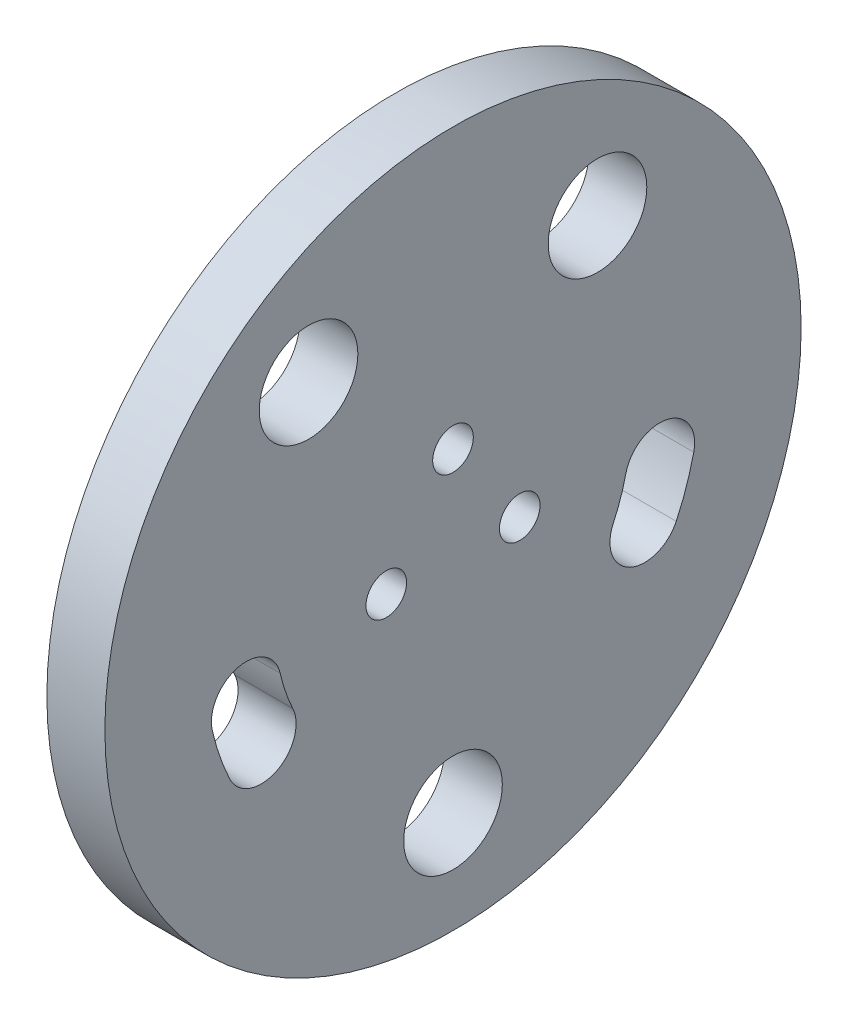
ISO-10303-21;
HEADER;
FILE_DESCRIPTION(('STEP AP214'),'2;1');
FILE_NAME('part.step','',(''),(''),'','','');
FILE_SCHEMA(('AUTOMOTIVE_DESIGN { 1 0 10303 214 1 1 1 1 }'));
ENDSEC;
DATA;
#1=APPLICATION_CONTEXT('core data for automotive mechanical design processes');
#2=APPLICATION_PROTOCOL_DEFINITION('international standard','automotive_design',2000,#1);
#3=PRODUCT_CONTEXT('',#1,'mechanical');
#4=PRODUCT('Part','Part','',(#3));
#5=PRODUCT_RELATED_PRODUCT_CATEGORY('part','',(#4));
#6=PRODUCT_DEFINITION_FORMATION('','',#4);
#7=PRODUCT_DEFINITION_CONTEXT('part definition',#1,'design');
#8=PRODUCT_DEFINITION('design','',#6,#7);
#9=PRODUCT_DEFINITION_SHAPE('','',#8);
#10=(LENGTH_UNIT() NAMED_UNIT(*) SI_UNIT(.MILLI.,.METRE.));
#11=(NAMED_UNIT(*) PLANE_ANGLE_UNIT() SI_UNIT($,.RADIAN.));
#12=(NAMED_UNIT(*) SI_UNIT($,.STERADIAN.) SOLID_ANGLE_UNIT());
#13=UNCERTAINTY_MEASURE_WITH_UNIT(LENGTH_MEASURE(1.E-05),#10,'distance_accuracy_value','');
#14=(GEOMETRIC_REPRESENTATION_CONTEXT(3) GLOBAL_UNCERTAINTY_ASSIGNED_CONTEXT((#13)) GLOBAL_UNIT_ASSIGNED_CONTEXT((#10,
#11,#12)) REPRESENTATION_CONTEXT('',''));
#15=CARTESIAN_POINT('',(0.,0.,0.));
#16=DIRECTION('',(0.,0.,1.));
#17=DIRECTION('',(1.,0.,0.));
#18=AXIS2_PLACEMENT_3D('',#15,#16,#17);
#19=CARTESIAN_POINT('',(0.,0.,0.));
#20=DIRECTION('',(1.,0.,0.));
#21=DIRECTION('',(0.,0.,-1.));
#22=AXIS2_PLACEMENT_3D('',#19,#20,#21);
#23=PLANE('',#22);
#24=DIRECTION('',(0.,0.,-1.));
#25=VECTOR('',#24,1.);
#26=CARTESIAN_POINT('',(0.,-7.44980159550946,-4.25678106682922));
#27=LINE('',#26,#25);
#28=CARTESIAN_POINT('',(0.,-7.44980159550946,4.25678106682922));
#29=VERTEX_POINT('',#28);
#30=CARTESIAN_POINT('',(0.,-7.44980159550946,-4.25678106682922));
#31=VERTEX_POINT('',#30);
#32=EDGE_CURVE('E161',#29,#31,#27,.T.);
#33=ORIENTED_EDGE('',*,*,#32,.F.);
#34=DIRECTION('',(0.,1.,0.));
#35=VECTOR('',#34,1.);
#36=CARTESIAN_POINT('',(0.,-7.44980159550946,4.25678106682922));
#37=LINE('',#36,#35);
#38=CARTESIAN_POINT('',(0.,-7.54980159550946,4.25678106682922));
#39=VERTEX_POINT('',#38);
#40=EDGE_CURVE('E58',#39,#29,#37,.T.);
#41=ORIENTED_EDGE('',*,*,#40,.F.);
#42=DIRECTION('',(0.,0.,1.));
#43=VECTOR('',#42,1.);
#44=CARTESIAN_POINT('',(0.,-7.54980159550946,-4.25678106682922));
#45=LINE('',#44,#43);
#46=CARTESIAN_POINT('',(0.,-7.54980159550946,-4.25678106682922));
#47=VERTEX_POINT('',#46);
#48=EDGE_CURVE('E152',#47,#39,#45,.T.);
#49=ORIENTED_EDGE('',*,*,#48,.F.);
#50=DIRECTION('',(0.,-1.,0.));
#51=VECTOR('',#50,1.);
#52=CARTESIAN_POINT('',(0.,-7.44980159550946,-4.25678106682922));
#53=LINE('',#52,#51);
#54=EDGE_CURVE('E155',#31,#47,#53,.T.);
#55=ORIENTED_EDGE('',*,*,#54,.F.);
#56=EDGE_LOOP('',(#33,#41,#49,#55));
#57=FACE_BOUND('',#56,.T.);
#58=CARTESIAN_POINT('',(0.,0.,0.));
#59=DIRECTION('',(1.,0.,0.));
#60=DIRECTION('',(0.,0.,-1.));
#61=AXIS2_PLACEMENT_3D('',#58,#59,#60);
#62=CIRCLE('',#61,15.2636934928289);
#63=CARTESIAN_POINT('',(0.,-3.34295875011745,14.8931180697005));
#64=VERTEX_POINT('',#63);
#65=CARTESIAN_POINT('',(0.,-6.50496417202533,13.8081780175262));
#66=VERTEX_POINT('',#65);
#67=EDGE_CURVE('E193',#64,#66,#62,.T.);
#68=ORIENTED_EDGE('',*,*,#67,.F.);
#69=CARTESIAN_POINT('',(0.,-4.,17.8202833871967));
#70=DIRECTION('',(1.,0.,0.));
#71=DIRECTION('',(0.,0.,-1.));
#72=AXIS2_PLACEMENT_3D('',#69,#70,#71);
#73=CIRCLE('',#72,3.);
#74=CARTESIAN_POINT('',(0.,-4.65704124988254,20.747448704693));
#75=VERTEX_POINT('',#74);
#76=EDGE_CURVE('E183',#64,#75,#73,.T.);
#77=ORIENTED_EDGE('',*,*,#76,.T.);
#78=CARTESIAN_POINT('',(0.,0.,0.));
#79=DIRECTION('',(1.,0.,0.));
#80=DIRECTION('',(0.,0.,-1.));
#81=AXIS2_PLACEMENT_3D('',#78,#79,#80);
#82=CIRCLE('',#81,21.2636934928289);
#83=CARTESIAN_POINT('',(0.,-9.06199829030665,19.2360299423621));
#84=VERTEX_POINT('',#83);
#85=EDGE_CURVE('E186',#75,#84,#82,.T.);
#86=ORIENTED_EDGE('',*,*,#85,.T.);
#87=CARTESIAN_POINT('',(0.,-7.78348123116599,16.5221039799442));
#88=DIRECTION('',(1.,0.,0.));
#89=DIRECTION('',(0.,0.,-1.));
#90=AXIS2_PLACEMENT_3D('',#87,#88,#89);
#91=CIRCLE('',#90,3.);
#92=EDGE_CURVE('E190',#84,#66,#91,.T.);
#93=ORIENTED_EDGE('',*,*,#92,.T.);
#94=EDGE_LOOP('',(#68,#77,#86,#93));
#95=FACE_BOUND('',#94,.T.);
#96=CARTESIAN_POINT('',(0.,0.,0.));
#97=DIRECTION('',(1.,0.,0.));
#98=DIRECTION('',(0.,0.,-1.));
#99=AXIS2_PLACEMENT_3D('',#96,#97,#98);
#100=CIRCLE('',#99,15.2636934928289);
#101=CARTESIAN_POINT('',(0.,-6.50496417202534,-13.8081780175262));
#102=VERTEX_POINT('',#101);
#103=CARTESIAN_POINT('',(0.,-3.34295875011745,-14.8931180697005));
#104=VERTEX_POINT('',#103);
#105=EDGE_CURVE('E217',#102,#104,#100,.T.);
#106=ORIENTED_EDGE('',*,*,#105,.F.);
#107=CARTESIAN_POINT('',(0.,-7.78348123116599,-16.5221039799442));
#108=DIRECTION('',(1.,0.,0.));
#109=DIRECTION('',(0.,0.,-1.));
#110=AXIS2_PLACEMENT_3D('',#107,#108,#109);
#111=CIRCLE('',#110,3.);
#112=CARTESIAN_POINT('',(0.,-9.06199829030666,-19.2360299423621));
#113=VERTEX_POINT('',#112);
#114=EDGE_CURVE('E227',#102,#113,#111,.T.);
#115=ORIENTED_EDGE('',*,*,#114,.T.);
#116=CARTESIAN_POINT('',(0.,0.,0.));
#117=DIRECTION('',(1.,0.,0.));
#118=DIRECTION('',(0.,0.,-1.));
#119=AXIS2_PLACEMENT_3D('',#116,#117,#118);
#120=CIRCLE('',#119,21.2636934928289);
#121=CARTESIAN_POINT('',(0.,-4.65704124988254,-20.747448704693));
#122=VERTEX_POINT('',#121);
#123=EDGE_CURVE('E238',#113,#122,#120,.T.);
#124=ORIENTED_EDGE('',*,*,#123,.T.);
#125=CARTESIAN_POINT('',(0.,-4.,-17.8202833871967));
#126=DIRECTION('',(1.,0.,0.));
#127=DIRECTION('',(0.,0.,-1.));
#128=AXIS2_PLACEMENT_3D('',#125,#126,#127);
#129=CIRCLE('',#128,3.);
#130=EDGE_CURVE('E235',#122,#104,#129,.T.);
#131=ORIENTED_EDGE('',*,*,#130,.T.);
#132=EDGE_LOOP('',(#106,#115,#124,#131));
#133=FACE_BOUND('',#132,.T.);
#134=CARTESIAN_POINT('',(0.,5.9534,0.));
#135=DIRECTION('',(1.,0.,0.));
#136=DIRECTION('',(0.,0.,-1.));
#137=AXIS2_PLACEMENT_3D('',#134,#135,#136);
#138=CIRCLE('',#137,1.74999999999999);
#139=CARTESIAN_POINT('',(0.,5.9534,-1.74999999999999));
#140=VERTEX_POINT('',#139);
#141=EDGE_CURVE('E45',#140,#140,#138,.T.);
#142=ORIENTED_EDGE('',*,*,#141,.T.);
#143=EDGE_LOOP('',(#142));
#144=FACE_BOUND('',#143,.T.);
#145=CARTESIAN_POINT('',(0.,-2.,5.75000000000001));
#146=DIRECTION('',(1.,0.,0.));
#147=DIRECTION('',(0.,0.,-1.));
#148=AXIS2_PLACEMENT_3D('',#145,#146,#147);
#149=CIRCLE('',#148,1.74999999999999);
#150=CARTESIAN_POINT('',(0.,-2.,4.00000000000001));
#151=VERTEX_POINT('',#150);
#152=EDGE_CURVE('E248',#151,#151,#149,.T.);
#153=ORIENTED_EDGE('',*,*,#152,.T.);
#154=EDGE_LOOP('',(#153));
#155=FACE_BOUND('',#154,.T.);
#156=CARTESIAN_POINT('',(0.,-2.,-5.75));
#157=DIRECTION('',(1.,0.,0.));
#158=DIRECTION('',(0.,0.,-1.));
#159=AXIS2_PLACEMENT_3D('',#156,#157,#158);
#160=CIRCLE('',#159,1.74999999999999);
#161=CARTESIAN_POINT('',(0.,-2.,-7.49999999999999));
#162=VERTEX_POINT('',#161);
#163=EDGE_CURVE('E252',#162,#162,#160,.T.);
#164=ORIENTED_EDGE('',*,*,#163,.T.);
#165=EDGE_LOOP('',(#164));
#166=FACE_BOUND('',#165,.T.);
#167=CARTESIAN_POINT('',(0.,17.15,12.45));
#168=DIRECTION('',(1.,0.,0.));
#169=DIRECTION('',(0.,0.,-1.));
#170=AXIS2_PLACEMENT_3D('',#167,#168,#169);
#171=CIRCLE('',#170,4.24999999999999);
#172=CARTESIAN_POINT('',(0.,17.15,8.20000000000001));
#173=VERTEX_POINT('',#172);
#174=EDGE_CURVE('E256',#173,#173,#171,.T.);
#175=ORIENTED_EDGE('',*,*,#174,.T.);
#176=EDGE_LOOP('',(#175));
#177=FACE_BOUND('',#176,.T.);
#178=CARTESIAN_POINT('',(0.,17.15,-12.45));
#179=DIRECTION('',(1.,0.,0.));
#180=DIRECTION('',(0.,0.,-1.));
#181=AXIS2_PLACEMENT_3D('',#178,#179,#180);
#182=CIRCLE('',#181,4.24999999999999);
#183=CARTESIAN_POINT('',(0.,17.15,-16.7));
#184=VERTEX_POINT('',#183);
#185=EDGE_CURVE('E260',#184,#184,#182,.T.);
#186=ORIENTED_EDGE('',*,*,#185,.T.);
#187=EDGE_LOOP('',(#186));
#188=FACE_BOUND('',#187,.T.);
#189=CARTESIAN_POINT('',(0.,-21.2,0.));
#190=DIRECTION('',(1.,0.,0.));
#191=DIRECTION('',(0.,0.,-1.));
#192=AXIS2_PLACEMENT_3D('',#189,#190,#191);
#193=CIRCLE('',#192,4.24999999999999);
#194=CARTESIAN_POINT('',(0.,-21.2,-4.25000000000007));
#195=VERTEX_POINT('',#194);
#196=EDGE_CURVE('E263',#195,#195,#193,.T.);
#197=ORIENTED_EDGE('',*,*,#196,.T.);
#198=EDGE_LOOP('',(#197));
#199=FACE_BOUND('',#198,.T.);
#200=CARTESIAN_POINT('',(0.,0.,0.));
#201=DIRECTION('',(-1.,0.,0.));
#202=DIRECTION('',(0.,0.,1.));
#203=AXIS2_PLACEMENT_3D('',#200,#201,#202);
#204=CIRCLE('',#203,26.8);
#205=CARTESIAN_POINT('',(0.,0.,26.8));
#206=VERTEX_POINT('',#205);
#207=EDGE_CURVE('E167',#206,#206,#204,.T.);
#208=ORIENTED_EDGE('',*,*,#207,.T.);
#209=EDGE_LOOP('',(#208));
#210=FACE_BOUND('',#209,.T.);
#211=ADVANCED_FACE('F41',(#57,#95,#133,#144,#155,#166,#177,#188,#199,#210),#23,.F.);
#212=CARTESIAN_POINT('',(5.,0.,0.));
#213=DIRECTION('',(-1.,0.,0.));
#214=DIRECTION('',(0.,0.,1.));
#215=AXIS2_PLACEMENT_3D('',#212,#213,#214);
#216=CYLINDRICAL_SURFACE('',#215,30.);
#217=CARTESIAN_POINT('',(5.,0.,0.));
#218=DIRECTION('',(1.,0.,0.));
#219=DIRECTION('',(0.,0.,-1.));
#220=AXIS2_PLACEMENT_3D('',#217,#218,#219);
#221=CIRCLE('',#220,30.);
#222=CARTESIAN_POINT('',(5.,0.,-30.));
#223=VERTEX_POINT('',#222);
#224=EDGE_CURVE('E11',#223,#223,#221,.T.);
#225=ORIENTED_EDGE('',*,*,#224,.F.);
#226=EDGE_LOOP('',(#225));
#227=FACE_BOUND('',#226,.T.);
#228=CARTESIAN_POINT('',(0.,0.,0.));
#229=DIRECTION('',(1.,0.,0.));
#230=DIRECTION('',(0.,0.,-1.));
#231=AXIS2_PLACEMENT_3D('',#228,#229,#230);
#232=CIRCLE('',#231,30.);
#233=CARTESIAN_POINT('',(0.,0.,-30.));
#234=VERTEX_POINT('',#233);
#235=EDGE_CURVE('E50',#234,#234,#232,.T.);
#236=ORIENTED_EDGE('',*,*,#235,.T.);
#237=EDGE_LOOP('',(#236));
#238=FACE_BOUND('',#237,.T.);
#239=ADVANCED_FACE('F43',(#227,#238),#216,.T.);
#240=CARTESIAN_POINT('',(5.,0.,0.));
#241=DIRECTION('',(1.,0.,0.));
#242=DIRECTION('',(0.,0.,-1.));
#243=AXIS2_PLACEMENT_3D('',#240,#241,#242);
#244=PLANE('',#243);
#245=CARTESIAN_POINT('',(5.,-4.,17.8202833871967));
#246=DIRECTION('',(1.,0.,0.));
#247=DIRECTION('',(0.,0.,-1.));
#248=AXIS2_PLACEMENT_3D('',#245,#246,#247);
#249=CIRCLE('',#248,3.);
#250=CARTESIAN_POINT('',(5.,-3.34295875011745,14.8931180697005));
#251=VERTEX_POINT('',#250);
#252=CARTESIAN_POINT('',(5.,-4.65704124988254,20.747448704693));
#253=VERTEX_POINT('',#252);
#254=EDGE_CURVE('E66',#251,#253,#249,.T.);
#255=ORIENTED_EDGE('',*,*,#254,.F.);
#256=CARTESIAN_POINT('',(5.,0.,0.));
#257=DIRECTION('',(1.,0.,0.));
#258=DIRECTION('',(0.,0.,-1.));
#259=AXIS2_PLACEMENT_3D('',#256,#257,#258);
#260=CIRCLE('',#259,15.2636934928289);
#261=CARTESIAN_POINT('',(5.,-6.50496417202533,13.8081780175262));
#262=VERTEX_POINT('',#261);
#263=EDGE_CURVE('E187',#251,#262,#260,.T.);
#264=ORIENTED_EDGE('',*,*,#263,.T.);
#265=CARTESIAN_POINT('',(5.,-7.78348123116599,16.5221039799442));
#266=DIRECTION('',(1.,0.,0.));
#267=DIRECTION('',(0.,0.,-1.));
#268=AXIS2_PLACEMENT_3D('',#265,#266,#267);
#269=CIRCLE('',#268,3.);
#270=CARTESIAN_POINT('',(5.,-9.06199829030665,19.2360299423621));
#271=VERTEX_POINT('',#270);
#272=EDGE_CURVE('E201',#271,#262,#269,.T.);
#273=ORIENTED_EDGE('',*,*,#272,.F.);
#274=CARTESIAN_POINT('',(5.,0.,0.));
#275=DIRECTION('',(1.,0.,0.));
#276=DIRECTION('',(0.,0.,-1.));
#277=AXIS2_PLACEMENT_3D('',#274,#275,#276);
#278=CIRCLE('',#277,21.2636934928289);
#279=EDGE_CURVE('E197',#253,#271,#278,.T.);
#280=ORIENTED_EDGE('',*,*,#279,.F.);
#281=EDGE_LOOP('',(#255,#264,#273,#280));
#282=FACE_BOUND('',#281,.T.);
#283=CARTESIAN_POINT('',(5.,-7.78348123116599,-16.5221039799442));
#284=DIRECTION('',(1.,0.,0.));
#285=DIRECTION('',(0.,0.,-1.));
#286=AXIS2_PLACEMENT_3D('',#283,#284,#285);
#287=CIRCLE('',#286,3.);
#288=CARTESIAN_POINT('',(5.,-6.50496417202534,-13.8081780175262));
#289=VERTEX_POINT('',#288);
#290=CARTESIAN_POINT('',(5.,-9.06199829030666,-19.2360299423621));
#291=VERTEX_POINT('',#290);
#292=EDGE_CURVE('E198',#289,#291,#287,.T.);
#293=ORIENTED_EDGE('',*,*,#292,.F.);
#294=CARTESIAN_POINT('',(5.,0.,0.));
#295=DIRECTION('',(1.,0.,0.));
#296=DIRECTION('',(0.,0.,-1.));
#297=AXIS2_PLACEMENT_3D('',#294,#295,#296);
#298=CIRCLE('',#297,15.2636934928289);
#299=CARTESIAN_POINT('',(5.,-3.34295875011745,-14.8931180697005));
#300=VERTEX_POINT('',#299);
#301=EDGE_CURVE('E223',#289,#300,#298,.T.);
#302=ORIENTED_EDGE('',*,*,#301,.T.);
#303=CARTESIAN_POINT('',(5.,-4.,-17.8202833871967));
#304=DIRECTION('',(1.,0.,0.));
#305=DIRECTION('',(0.,0.,-1.));
#306=AXIS2_PLACEMENT_3D('',#303,#304,#305);
#307=CIRCLE('',#306,3.);
#308=CARTESIAN_POINT('',(5.,-4.65704124988254,-20.747448704693));
#309=VERTEX_POINT('',#308);
#310=EDGE_CURVE('E226',#309,#300,#307,.T.);
#311=ORIENTED_EDGE('',*,*,#310,.F.);
#312=CARTESIAN_POINT('',(5.,0.,0.));
#313=DIRECTION('',(1.,0.,0.));
#314=DIRECTION('',(0.,0.,-1.));
#315=AXIS2_PLACEMENT_3D('',#312,#313,#314);
#316=CIRCLE('',#315,21.2636934928289);
#317=EDGE_CURVE('E230',#291,#309,#316,.T.);
#318=ORIENTED_EDGE('',*,*,#317,.F.);
#319=EDGE_LOOP('',(#293,#302,#311,#318));
#320=FACE_BOUND('',#319,.T.);
#321=CARTESIAN_POINT('',(5.,5.9534,0.));
#322=DIRECTION('',(1.,0.,0.));
#323=DIRECTION('',(0.,0.,-1.));
#324=AXIS2_PLACEMENT_3D('',#321,#322,#323);
#325=CIRCLE('',#324,1.75);
#326=CARTESIAN_POINT('',(5.,5.9534,-1.75));
#327=VERTEX_POINT('',#326);
#328=EDGE_CURVE('E208',#327,#327,#325,.T.);
#329=ORIENTED_EDGE('',*,*,#328,.F.);
#330=EDGE_LOOP('',(#329));
#331=FACE_BOUND('',#330,.T.);
#332=CARTESIAN_POINT('',(5.,-2.,5.75000000000001));
#333=DIRECTION('',(1.,0.,0.));
#334=DIRECTION('',(0.,0.,-1.));
#335=AXIS2_PLACEMENT_3D('',#332,#333,#334);
#336=CIRCLE('',#335,1.75);
#337=CARTESIAN_POINT('',(5.,-2.,4.00000000000001));
#338=VERTEX_POINT('',#337);
#339=EDGE_CURVE('E245',#338,#338,#336,.T.);
#340=ORIENTED_EDGE('',*,*,#339,.F.);
#341=EDGE_LOOP('',(#340));
#342=FACE_BOUND('',#341,.T.);
#343=CARTESIAN_POINT('',(5.,-2.,-5.75));
#344=DIRECTION('',(1.,0.,0.));
#345=DIRECTION('',(0.,0.,-1.));
#346=AXIS2_PLACEMENT_3D('',#343,#344,#345);
#347=CIRCLE('',#346,1.75);
#348=CARTESIAN_POINT('',(5.,-2.,-7.49999999999999));
#349=VERTEX_POINT('',#348);
#350=EDGE_CURVE('E249',#349,#349,#347,.T.);
#351=ORIENTED_EDGE('',*,*,#350,.F.);
#352=EDGE_LOOP('',(#351));
#353=FACE_BOUND('',#352,.T.);
#354=CARTESIAN_POINT('',(5.,17.15,12.45));
#355=DIRECTION('',(1.,0.,0.));
#356=DIRECTION('',(0.,0.,-1.));
#357=AXIS2_PLACEMENT_3D('',#354,#355,#356);
#358=CIRCLE('',#357,4.25);
#359=CARTESIAN_POINT('',(5.,17.15,8.20000000000001));
#360=VERTEX_POINT('',#359);
#361=EDGE_CURVE('E253',#360,#360,#358,.T.);
#362=ORIENTED_EDGE('',*,*,#361,.F.);
#363=EDGE_LOOP('',(#362));
#364=FACE_BOUND('',#363,.T.);
#365=CARTESIAN_POINT('',(5.,17.15,-12.45));
#366=DIRECTION('',(1.,0.,0.));
#367=DIRECTION('',(0.,0.,-1.));
#368=AXIS2_PLACEMENT_3D('',#365,#366,#367);
#369=CIRCLE('',#368,4.25);
#370=CARTESIAN_POINT('',(5.,17.15,-16.7));
#371=VERTEX_POINT('',#370);
#372=EDGE_CURVE('E257',#371,#371,#369,.T.);
#373=ORIENTED_EDGE('',*,*,#372,.F.);
#374=EDGE_LOOP('',(#373));
#375=FACE_BOUND('',#374,.T.);
#376=CARTESIAN_POINT('',(5.,-21.2,0.));
#377=DIRECTION('',(1.,0.,0.));
#378=DIRECTION('',(0.,0.,-1.));
#379=AXIS2_PLACEMENT_3D('',#376,#377,#378);
#380=CIRCLE('',#379,4.25);
#381=CARTESIAN_POINT('',(5.,-21.2,-4.25000000000007));
#382=VERTEX_POINT('',#381);
#383=EDGE_CURVE('E261',#382,#382,#380,.T.);
#384=ORIENTED_EDGE('',*,*,#383,.F.);
#385=EDGE_LOOP('',(#384));
#386=FACE_BOUND('',#385,.T.);
#387=ORIENTED_EDGE('',*,*,#224,.T.);
#388=EDGE_LOOP('',(#387));
#389=FACE_BOUND('',#388,.T.);
#390=ADVANCED_FACE('F303',(#282,#320,#331,#342,#353,#364,#375,#386,#389),#244,.T.);
#391=CARTESIAN_POINT('',(0.,0.,0.));
#392=DIRECTION('',(-1.,0.,0.));
#393=DIRECTION('',(0.,0.,1.));
#394=AXIS2_PLACEMENT_3D('',#391,#392,#393);
#395=CIRCLE('',#394,28.8);
#396=CARTESIAN_POINT('',(0.,0.,28.8));
#397=VERTEX_POINT('',#396);
#398=EDGE_CURVE('E175',#397,#397,#395,.T.);
#399=ORIENTED_EDGE('',*,*,#398,.F.);
#400=EDGE_LOOP('',(#399));
#401=FACE_BOUND('',#400,.T.);
#402=ORIENTED_EDGE('',*,*,#235,.F.);
#403=EDGE_LOOP('',(#402));
#404=FACE_BOUND('',#403,.T.);
#405=ADVANCED_FACE('F297',(#401,#404),#23,.F.);
#406=CARTESIAN_POINT('',(5.,-21.2,0.));
#407=DIRECTION('',(1.,0.,0.));
#408=DIRECTION('',(0.,0.,-1.));
#409=AXIS2_PLACEMENT_3D('',#406,#407,#408);
#410=CYLINDRICAL_SURFACE('',#409,4.24999999999999);
#411=ORIENTED_EDGE('',*,*,#383,.T.);
#412=EDGE_LOOP('',(#411));
#413=FACE_BOUND('',#412,.T.);
#414=ORIENTED_EDGE('',*,*,#196,.F.);
#415=EDGE_LOOP('',(#414));
#416=FACE_BOUND('',#415,.T.);
#417=ADVANCED_FACE('F308',(#413,#416),#410,.F.);
#418=CARTESIAN_POINT('',(5.,17.15,-12.45));
#419=DIRECTION('',(1.,0.,0.));
#420=DIRECTION('',(0.,0.,-1.));
#421=AXIS2_PLACEMENT_3D('',#418,#419,#420);
#422=CYLINDRICAL_SURFACE('',#421,4.24999999999999);
#423=ORIENTED_EDGE('',*,*,#372,.T.);
#424=EDGE_LOOP('',(#423));
#425=FACE_BOUND('',#424,.T.);
#426=ORIENTED_EDGE('',*,*,#185,.F.);
#427=EDGE_LOOP('',(#426));
#428=FACE_BOUND('',#427,.T.);
#429=ADVANCED_FACE('F315',(#425,#428),#422,.F.);
#430=CARTESIAN_POINT('',(5.,17.15,12.45));
#431=DIRECTION('',(1.,0.,0.));
#432=DIRECTION('',(0.,0.,-1.));
#433=AXIS2_PLACEMENT_3D('',#430,#431,#432);
#434=CYLINDRICAL_SURFACE('',#433,4.24999999999999);
#435=ORIENTED_EDGE('',*,*,#361,.T.);
#436=EDGE_LOOP('',(#435));
#437=FACE_BOUND('',#436,.T.);
#438=ORIENTED_EDGE('',*,*,#174,.F.);
#439=EDGE_LOOP('',(#438));
#440=FACE_BOUND('',#439,.T.);
#441=ADVANCED_FACE('F292',(#437,#440),#434,.F.);
#442=CARTESIAN_POINT('',(5.,-2.,-5.75));
#443=DIRECTION('',(1.,0.,0.));
#444=DIRECTION('',(0.,0.,-1.));
#445=AXIS2_PLACEMENT_3D('',#442,#443,#444);
#446=CYLINDRICAL_SURFACE('',#445,1.74999999999999);
#447=ORIENTED_EDGE('',*,*,#350,.T.);
#448=EDGE_LOOP('',(#447));
#449=FACE_BOUND('',#448,.T.);
#450=ORIENTED_EDGE('',*,*,#163,.F.);
#451=EDGE_LOOP('',(#450));
#452=FACE_BOUND('',#451,.T.);
#453=ADVANCED_FACE('F282',(#449,#452),#446,.F.);
#454=CARTESIAN_POINT('',(5.,-2.,5.75000000000001));
#455=DIRECTION('',(1.,0.,0.));
#456=DIRECTION('',(0.,0.,-1.));
#457=AXIS2_PLACEMENT_3D('',#454,#455,#456);
#458=CYLINDRICAL_SURFACE('',#457,1.74999999999999);
#459=ORIENTED_EDGE('',*,*,#339,.T.);
#460=EDGE_LOOP('',(#459));
#461=FACE_BOUND('',#460,.T.);
#462=ORIENTED_EDGE('',*,*,#152,.F.);
#463=EDGE_LOOP('',(#462));
#464=FACE_BOUND('',#463,.T.);
#465=ADVANCED_FACE('F279',(#461,#464),#458,.F.);
#466=CARTESIAN_POINT('',(5.,5.9534,0.));
#467=DIRECTION('',(1.,0.,0.));
#468=DIRECTION('',(0.,0.,-1.));
#469=AXIS2_PLACEMENT_3D('',#466,#467,#468);
#470=CYLINDRICAL_SURFACE('',#469,1.74999999999999);
#471=ORIENTED_EDGE('',*,*,#328,.T.);
#472=EDGE_LOOP('',(#471));
#473=FACE_BOUND('',#472,.T.);
#474=ORIENTED_EDGE('',*,*,#141,.F.);
#475=EDGE_LOOP('',(#474));
#476=FACE_BOUND('',#475,.T.);
#477=ADVANCED_FACE('F281',(#473,#476),#470,.F.);
#478=CARTESIAN_POINT('',(0.,-7.78348123116599,-16.5221039799442));
#479=DIRECTION('',(1.,0.,0.));
#480=DIRECTION('',(0.,0.,-1.));
#481=AXIS2_PLACEMENT_3D('',#478,#479,#480);
#482=CYLINDRICAL_SURFACE('',#481,3.);
#483=ORIENTED_EDGE('',*,*,#292,.T.);
#484=DIRECTION('',(1.,0.,0.));
#485=VECTOR('',#484,1.);
#486=CARTESIAN_POINT('',(0.,-9.06199829030666,-19.2360299423621));
#487=LINE('',#486,#485);
#488=EDGE_CURVE('E214',#113,#291,#487,.T.);
#489=ORIENTED_EDGE('',*,*,#488,.F.);
#490=ORIENTED_EDGE('',*,*,#114,.F.);
#491=DIRECTION('',(1.,0.,0.));
#492=VECTOR('',#491,1.);
#493=CARTESIAN_POINT('',(0.,-6.50496417202534,-13.8081780175262));
#494=LINE('',#493,#492);
#495=EDGE_CURVE('E178',#102,#289,#494,.T.);
#496=ORIENTED_EDGE('',*,*,#495,.T.);
#497=EDGE_LOOP('',(#483,#489,#490,#496));
#498=FACE_BOUND('',#497,.T.);
#499=ADVANCED_FACE('F289',(#498),#482,.F.);
#500=CARTESIAN_POINT('',(0.,0.,0.));
#501=DIRECTION('',(1.,0.,0.));
#502=DIRECTION('',(0.,0.,-1.));
#503=AXIS2_PLACEMENT_3D('',#500,#501,#502);
#504=CYLINDRICAL_SURFACE('',#503,15.2636934928289);
#505=ORIENTED_EDGE('',*,*,#301,.F.);
#506=ORIENTED_EDGE('',*,*,#495,.F.);
#507=ORIENTED_EDGE('',*,*,#105,.T.);
#508=DIRECTION('',(1.,0.,0.));
#509=VECTOR('',#508,1.);
#510=CARTESIAN_POINT('',(0.,-3.34295875011745,-14.8931180697005));
#511=LINE('',#510,#509);
#512=EDGE_CURVE('E220',#104,#300,#511,.T.);
#513=ORIENTED_EDGE('',*,*,#512,.T.);
#514=EDGE_LOOP('',(#505,#506,#507,#513));
#515=FACE_BOUND('',#514,.T.);
#516=ADVANCED_FACE('F357',(#515),#504,.T.);
#517=CARTESIAN_POINT('',(0.,-4.,-17.8202833871967));
#518=DIRECTION('',(1.,0.,0.));
#519=DIRECTION('',(0.,0.,-1.));
#520=AXIS2_PLACEMENT_3D('',#517,#518,#519);
#521=CYLINDRICAL_SURFACE('',#520,3.);
#522=ORIENTED_EDGE('',*,*,#310,.T.);
#523=ORIENTED_EDGE('',*,*,#512,.F.);
#524=ORIENTED_EDGE('',*,*,#130,.F.);
#525=DIRECTION('',(1.,0.,0.));
#526=VECTOR('',#525,1.);
#527=CARTESIAN_POINT('',(0.,-4.65704124988254,-20.747448704693));
#528=LINE('',#527,#526);
#529=EDGE_CURVE('E218',#122,#309,#528,.T.);
#530=ORIENTED_EDGE('',*,*,#529,.T.);
#531=EDGE_LOOP('',(#522,#523,#524,#530));
#532=FACE_BOUND('',#531,.T.);
#533=ADVANCED_FACE('F361',(#532),#521,.F.);
#534=CARTESIAN_POINT('',(0.,0.,0.));
#535=DIRECTION('',(1.,0.,0.));
#536=DIRECTION('',(0.,0.,-1.));
#537=AXIS2_PLACEMENT_3D('',#534,#535,#536);
#538=CYLINDRICAL_SURFACE('',#537,21.2636934928289);
#539=ORIENTED_EDGE('',*,*,#317,.T.);
#540=ORIENTED_EDGE('',*,*,#529,.F.);
#541=ORIENTED_EDGE('',*,*,#123,.F.);
#542=ORIENTED_EDGE('',*,*,#488,.T.);
#543=EDGE_LOOP('',(#539,#540,#541,#542));
#544=FACE_BOUND('',#543,.T.);
#545=ADVANCED_FACE('F354',(#544),#538,.F.);
#546=CARTESIAN_POINT('',(0.,-4.,17.8202833871967));
#547=DIRECTION('',(1.,0.,0.));
#548=DIRECTION('',(0.,0.,-1.));
#549=AXIS2_PLACEMENT_3D('',#546,#547,#548);
#550=CYLINDRICAL_SURFACE('',#549,3.);
#551=ORIENTED_EDGE('',*,*,#254,.T.);
#552=DIRECTION('',(1.,0.,0.));
#553=VECTOR('',#552,1.);
#554=CARTESIAN_POINT('',(0.,-4.65704124988254,20.747448704693));
#555=LINE('',#554,#553);
#556=EDGE_CURVE('E195',#75,#253,#555,.T.);
#557=ORIENTED_EDGE('',*,*,#556,.F.);
#558=ORIENTED_EDGE('',*,*,#76,.F.);
#559=DIRECTION('',(1.,0.,0.));
#560=VECTOR('',#559,1.);
#561=CARTESIAN_POINT('',(0.,-3.34295875011745,14.8931180697005));
#562=LINE('',#561,#560);
#563=EDGE_CURVE('E206',#64,#251,#562,.T.);
#564=ORIENTED_EDGE('',*,*,#563,.T.);
#565=EDGE_LOOP('',(#551,#557,#558,#564));
#566=FACE_BOUND('',#565,.T.);
#567=ADVANCED_FACE('F345',(#566),#550,.F.);
#568=CARTESIAN_POINT('',(0.,0.,0.));
#569=DIRECTION('',(1.,0.,0.));
#570=DIRECTION('',(0.,0.,-1.));
#571=AXIS2_PLACEMENT_3D('',#568,#569,#570);
#572=CYLINDRICAL_SURFACE('',#571,15.2636934928289);
#573=ORIENTED_EDGE('',*,*,#263,.F.);
#574=ORIENTED_EDGE('',*,*,#563,.F.);
#575=ORIENTED_EDGE('',*,*,#67,.T.);
#576=DIRECTION('',(1.,0.,0.));
#577=VECTOR('',#576,1.);
#578=CARTESIAN_POINT('',(0.,-6.50496417202533,13.8081780175262));
#579=LINE('',#578,#577);
#580=EDGE_CURVE('E209',#66,#262,#579,.T.);
#581=ORIENTED_EDGE('',*,*,#580,.T.);
#582=EDGE_LOOP('',(#573,#574,#575,#581));
#583=FACE_BOUND('',#582,.T.);
#584=ADVANCED_FACE('F341',(#583),#572,.T.);
#585=CARTESIAN_POINT('',(0.,-7.78348123116599,16.5221039799442));
#586=DIRECTION('',(1.,0.,0.));
#587=DIRECTION('',(0.,0.,-1.));
#588=AXIS2_PLACEMENT_3D('',#585,#586,#587);
#589=CYLINDRICAL_SURFACE('',#588,3.);
#590=ORIENTED_EDGE('',*,*,#272,.T.);
#591=ORIENTED_EDGE('',*,*,#580,.F.);
#592=ORIENTED_EDGE('',*,*,#92,.F.);
#593=DIRECTION('',(1.,0.,0.));
#594=VECTOR('',#593,1.);
#595=CARTESIAN_POINT('',(0.,-9.06199829030665,19.2360299423621));
#596=LINE('',#595,#594);
#597=EDGE_CURVE('E211',#84,#271,#596,.T.);
#598=ORIENTED_EDGE('',*,*,#597,.T.);
#599=EDGE_LOOP('',(#590,#591,#592,#598));
#600=FACE_BOUND('',#599,.T.);
#601=ADVANCED_FACE('F344',(#600),#589,.F.);
#602=CARTESIAN_POINT('',(0.,0.,0.));
#603=DIRECTION('',(1.,0.,0.));
#604=DIRECTION('',(0.,0.,-1.));
#605=AXIS2_PLACEMENT_3D('',#602,#603,#604);
#606=CYLINDRICAL_SURFACE('',#605,21.2636934928289);
#607=ORIENTED_EDGE('',*,*,#279,.T.);
#608=ORIENTED_EDGE('',*,*,#597,.F.);
#609=ORIENTED_EDGE('',*,*,#85,.F.);
#610=ORIENTED_EDGE('',*,*,#556,.T.);
#611=EDGE_LOOP('',(#607,#608,#609,#610));
#612=FACE_BOUND('',#611,.T.);
#613=ADVANCED_FACE('F335',(#612),#606,.F.);
#614=CARTESIAN_POINT('',(1.,0.,0.));
#615=DIRECTION('',(-1.,0.,0.));
#616=DIRECTION('',(0.,0.,1.));
#617=AXIS2_PLACEMENT_3D('',#614,#615,#616);
#618=CYLINDRICAL_SURFACE('',#617,26.8);
#619=CARTESIAN_POINT('',(1.,0.,0.));
#620=DIRECTION('',(-1.,0.,0.));
#621=DIRECTION('',(0.,0.,1.));
#622=AXIS2_PLACEMENT_3D('',#619,#620,#621);
#623=CIRCLE('',#622,26.8);
#624=CARTESIAN_POINT('',(1.,0.,26.8));
#625=VERTEX_POINT('',#624);
#626=EDGE_CURVE('E171',#625,#625,#623,.T.);
#627=ORIENTED_EDGE('',*,*,#626,.T.);
#628=EDGE_LOOP('',(#627));
#629=FACE_BOUND('',#628,.T.);
#630=ORIENTED_EDGE('',*,*,#207,.F.);
#631=EDGE_LOOP('',(#630));
#632=FACE_BOUND('',#631,.T.);
#633=ADVANCED_FACE('F328',(#629,#632),#618,.T.);
#634=CARTESIAN_POINT('',(1.,0.,0.));
#635=DIRECTION('',(-1.,0.,0.));
#636=DIRECTION('',(0.,0.,1.));
#637=AXIS2_PLACEMENT_3D('',#634,#635,#636);
#638=CYLINDRICAL_SURFACE('',#637,28.8);
#639=CARTESIAN_POINT('',(1.,0.,0.));
#640=DIRECTION('',(-1.,0.,0.));
#641=DIRECTION('',(0.,0.,1.));
#642=AXIS2_PLACEMENT_3D('',#639,#640,#641);
#643=CIRCLE('',#642,28.8);
#644=CARTESIAN_POINT('',(1.,0.,28.8));
#645=VERTEX_POINT('',#644);
#646=EDGE_CURVE('E174',#645,#645,#643,.T.);
#647=ORIENTED_EDGE('',*,*,#646,.F.);
#648=EDGE_LOOP('',(#647));
#649=FACE_BOUND('',#648,.T.);
#650=ORIENTED_EDGE('',*,*,#398,.T.);
#651=EDGE_LOOP('',(#650));
#652=FACE_BOUND('',#651,.T.);
#653=ADVANCED_FACE('F325',(#649,#652),#638,.F.);
#654=CARTESIAN_POINT('',(1.,0.,0.));
#655=DIRECTION('',(-1.,0.,0.));
#656=DIRECTION('',(0.,0.,1.));
#657=AXIS2_PLACEMENT_3D('',#654,#655,#656);
#658=PLANE('',#657);
#659=ORIENTED_EDGE('',*,*,#626,.F.);
#660=EDGE_LOOP('',(#659));
#661=FACE_BOUND('',#660,.T.);
#662=ORIENTED_EDGE('',*,*,#646,.T.);
#663=EDGE_LOOP('',(#662));
#664=FACE_BOUND('',#663,.T.);
#665=ADVANCED_FACE('F327',(#661,#664),#658,.T.);
#666=CARTESIAN_POINT('',(1.,-7.44980159550946,4.25678106682922));
#667=DIRECTION('',(0.,0.,1.));
#668=DIRECTION('',(1.,0.,0.));
#669=AXIS2_PLACEMENT_3D('',#666,#667,#668);
#670=PLANE('',#669);
#671=ORIENTED_EDGE('',*,*,#40,.T.);
#672=DIRECTION('',(-1.,0.,0.));
#673=VECTOR('',#672,1.);
#674=CARTESIAN_POINT('',(1.,-7.44980159550946,4.25678106682922));
#675=LINE('',#674,#673);
#676=CARTESIAN_POINT('',(1.,-7.44980159550946,4.25678106682922));
#677=VERTEX_POINT('',#676);
#678=EDGE_CURVE('E130',#677,#29,#675,.T.);
#679=ORIENTED_EDGE('',*,*,#678,.F.);
#680=DIRECTION('',(0.,1.,0.));
#681=VECTOR('',#680,1.);
#682=CARTESIAN_POINT('',(1.,-7.44980159550946,4.25678106682922));
#683=LINE('',#682,#681);
#684=CARTESIAN_POINT('',(1.,-7.54980159550946,4.25678106682922));
#685=VERTEX_POINT('',#684);
#686=EDGE_CURVE('E134',#685,#677,#683,.T.);
#687=ORIENTED_EDGE('',*,*,#686,.F.);
#688=DIRECTION('',(-1.,0.,0.));
#689=VECTOR('',#688,1.);
#690=CARTESIAN_POINT('',(1.,-7.54980159550946,4.25678106682922));
#691=LINE('',#690,#689);
#692=EDGE_CURVE('E165',#685,#39,#691,.T.);
#693=ORIENTED_EDGE('',*,*,#692,.T.);
#694=EDGE_LOOP('',(#671,#679,#687,#693));
#695=FACE_BOUND('',#694,.T.);
#696=ADVANCED_FACE('F132',(#695),#670,.F.);
#697=CARTESIAN_POINT('',(1.,-7.54980159550946,-4.25678106682922));
#698=DIRECTION('',(0.,-1.,0.));
#699=DIRECTION('',(0.,0.,-1.));
#700=AXIS2_PLACEMENT_3D('',#697,#698,#699);
#701=PLANE('',#700);
#702=ORIENTED_EDGE('',*,*,#48,.T.);
#703=ORIENTED_EDGE('',*,*,#692,.F.);
#704=DIRECTION('',(0.,0.,1.));
#705=VECTOR('',#704,1.);
#706=CARTESIAN_POINT('',(1.,-7.54980159550946,-4.25678106682922));
#707=LINE('',#706,#705);
#708=CARTESIAN_POINT('',(1.,-7.54980159550946,-4.25678106682922));
#709=VERTEX_POINT('',#708);
#710=EDGE_CURVE('E140',#709,#685,#707,.T.);
#711=ORIENTED_EDGE('',*,*,#710,.F.);
#712=DIRECTION('',(-1.,0.,0.));
#713=VECTOR('',#712,1.);
#714=CARTESIAN_POINT('',(1.,-7.54980159550946,-4.25678106682922));
#715=LINE('',#714,#713);
#716=EDGE_CURVE('E168',#709,#47,#715,.T.);
#717=ORIENTED_EDGE('',*,*,#716,.T.);
#718=EDGE_LOOP('',(#702,#703,#711,#717));
#719=FACE_BOUND('',#718,.T.);
#720=ADVANCED_FACE('F511',(#719),#701,.F.);
#721=CARTESIAN_POINT('',(1.,-7.44980159550946,-4.25678106682922));
#722=DIRECTION('',(0.,0.,-1.));
#723=DIRECTION('',(-1.,0.,0.));
#724=AXIS2_PLACEMENT_3D('',#721,#722,#723);
#725=PLANE('',#724);
#726=ORIENTED_EDGE('',*,*,#54,.T.);
#727=ORIENTED_EDGE('',*,*,#716,.F.);
#728=DIRECTION('',(0.,-1.,0.));
#729=VECTOR('',#728,1.);
#730=CARTESIAN_POINT('',(1.,-7.44980159550946,-4.25678106682922));
#731=LINE('',#730,#729);
#732=CARTESIAN_POINT('',(1.,-7.44980159550946,-4.25678106682922));
#733=VERTEX_POINT('',#732);
#734=EDGE_CURVE('E148',#733,#709,#731,.T.);
#735=ORIENTED_EDGE('',*,*,#734,.F.);
#736=DIRECTION('',(-1.,0.,0.));
#737=VECTOR('',#736,1.);
#738=CARTESIAN_POINT('',(1.,-7.44980159550946,-4.25678106682922));
#739=LINE('',#738,#737);
#740=EDGE_CURVE('E139',#733,#31,#739,.T.);
#741=ORIENTED_EDGE('',*,*,#740,.T.);
#742=EDGE_LOOP('',(#726,#727,#735,#741));
#743=FACE_BOUND('',#742,.T.);
#744=ADVANCED_FACE('F519',(#743),#725,.F.);
#745=CARTESIAN_POINT('',(1.,-7.44980159550946,-4.25678106682922));
#746=DIRECTION('',(0.,1.,0.));
#747=DIRECTION('',(0.,0.,1.));
#748=AXIS2_PLACEMENT_3D('',#745,#746,#747);
#749=PLANE('',#748);
#750=ORIENTED_EDGE('',*,*,#32,.T.);
#751=ORIENTED_EDGE('',*,*,#740,.F.);
#752=DIRECTION('',(0.,0.,-1.));
#753=VECTOR('',#752,1.);
#754=CARTESIAN_POINT('',(1.,-7.44980159550946,-4.25678106682922));
#755=LINE('',#754,#753);
#756=EDGE_CURVE('E143',#677,#733,#755,.T.);
#757=ORIENTED_EDGE('',*,*,#756,.F.);
#758=ORIENTED_EDGE('',*,*,#678,.T.);
#759=EDGE_LOOP('',(#750,#751,#757,#758));
#760=FACE_BOUND('',#759,.T.);
#761=ADVANCED_FACE('F144',(#760),#749,.F.);
#762=CARTESIAN_POINT('',(1.,0.,0.));
#763=DIRECTION('',(-1.,0.,0.));
#764=DIRECTION('',(0.,0.,1.));
#765=AXIS2_PLACEMENT_3D('',#762,#763,#764);
#766=PLANE('',#765);
#767=ORIENTED_EDGE('',*,*,#686,.T.);
#768=ORIENTED_EDGE('',*,*,#756,.T.);
#769=ORIENTED_EDGE('',*,*,#734,.T.);
#770=ORIENTED_EDGE('',*,*,#710,.T.);
#771=EDGE_LOOP('',(#767,#768,#769,#770));
#772=FACE_BOUND('',#771,.T.);
#773=ADVANCED_FACE('F150',(#772),#766,.T.);
#774=CLOSED_SHELL('',(#211,#239,#390,#405,#417,#429,#441,#453,#465,#477,#499,#516,#533,#545,
#567,#584,#601,#613,#633,#653,#665,#696,#720,#744,#761,#773));
#775=MANIFOLD_SOLID_BREP('B2',#774);
#776=ADVANCED_BREP_SHAPE_REPRESENTATION('',(#18,#775),#14);
#777=SHAPE_DEFINITION_REPRESENTATION(#9,#776);
ENDSEC;
END-ISO-10303-21;
